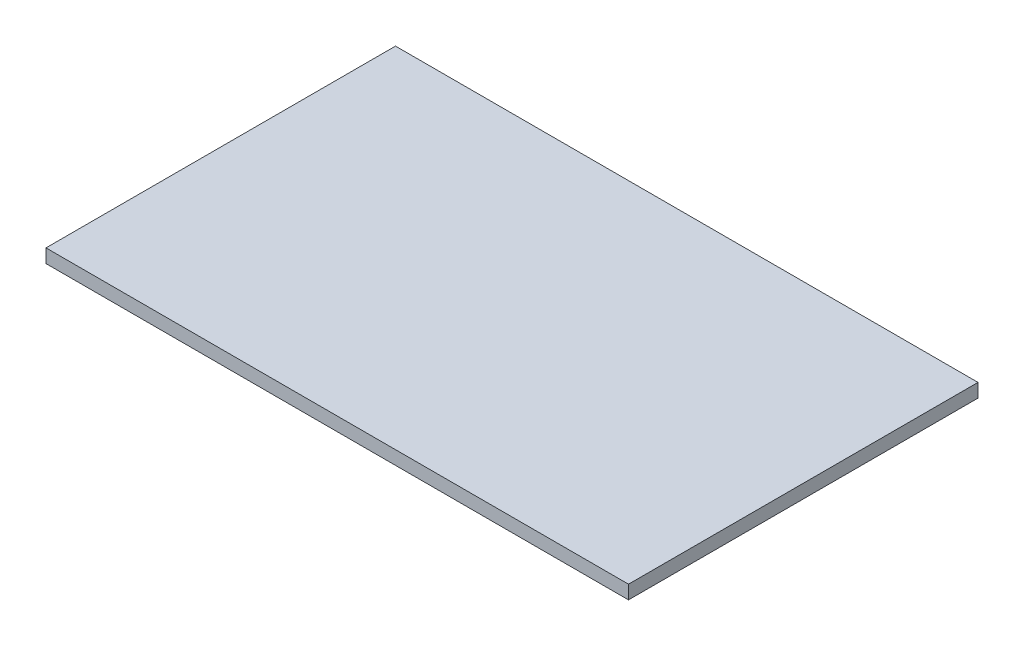
ISO-10303-21;
HEADER;
FILE_DESCRIPTION(('STEP AP214'),'2;1');
FILE_NAME('part.step','',(''),(''),'','','');
FILE_SCHEMA(('AUTOMOTIVE_DESIGN { 1 0 10303 214 1 1 1 1 }'));
ENDSEC;
DATA;
#1=APPLICATION_CONTEXT('core data for automotive mechanical design processes');
#2=APPLICATION_PROTOCOL_DEFINITION('international standard','automotive_design',2000,#1);
#3=PRODUCT_CONTEXT('',#1,'mechanical');
#4=PRODUCT('Part','Part','',(#3));
#5=PRODUCT_RELATED_PRODUCT_CATEGORY('part','',(#4));
#6=PRODUCT_DEFINITION_FORMATION('','',#4);
#7=PRODUCT_DEFINITION_CONTEXT('part definition',#1,'design');
#8=PRODUCT_DEFINITION('design','',#6,#7);
#9=PRODUCT_DEFINITION_SHAPE('','',#8);
#10=(LENGTH_UNIT() NAMED_UNIT(*) SI_UNIT(.MILLI.,.METRE.));
#11=(NAMED_UNIT(*) PLANE_ANGLE_UNIT() SI_UNIT($,.RADIAN.));
#12=(NAMED_UNIT(*) SI_UNIT($,.STERADIAN.) SOLID_ANGLE_UNIT());
#13=UNCERTAINTY_MEASURE_WITH_UNIT(LENGTH_MEASURE(1.E-05),#10,'distance_accuracy_value','');
#14=(GEOMETRIC_REPRESENTATION_CONTEXT(3) GLOBAL_UNCERTAINTY_ASSIGNED_CONTEXT((#13)) GLOBAL_UNIT_ASSIGNED_CONTEXT((#10,
#11,#12)) REPRESENTATION_CONTEXT('',''));
#15=CARTESIAN_POINT('',(0.,0.,0.));
#16=DIRECTION('',(0.,0.,1.));
#17=DIRECTION('',(1.,0.,0.));
#18=AXIS2_PLACEMENT_3D('',#15,#16,#17);
#19=CARTESIAN_POINT('',(0.,2.9718,0.));
#20=DIRECTION('',(1.,0.,0.));
#21=DIRECTION('',(0.,0.,-1.));
#22=AXIS2_PLACEMENT_3D('',#19,#20,#21);
#23=PLANE('',#22);
#24=DIRECTION('',(0.,0.,1.));
#25=VECTOR('',#24,1.);
#26=CARTESIAN_POINT('',(0.,0.,0.));
#27=LINE('',#26,#25);
#28=CARTESIAN_POINT('',(0.,0.,-76.2));
#29=VERTEX_POINT('',#28);
#30=CARTESIAN_POINT('',(0.,0.,0.));
#31=VERTEX_POINT('',#30);
#32=EDGE_CURVE('E96',#29,#31,#27,.T.);
#33=ORIENTED_EDGE('',*,*,#32,.T.);
#34=DIRECTION('',(0.,-1.,0.));
#35=VECTOR('',#34,1.);
#36=CARTESIAN_POINT('',(0.,2.9718,0.));
#37=LINE('',#36,#35);
#38=CARTESIAN_POINT('',(0.,2.9718,0.));
#39=VERTEX_POINT('',#38);
#40=EDGE_CURVE('E11',#39,#31,#37,.T.);
#41=ORIENTED_EDGE('',*,*,#40,.F.);
#42=DIRECTION('',(0.,0.,1.));
#43=VECTOR('',#42,1.);
#44=CARTESIAN_POINT('',(0.,2.9718,0.));
#45=LINE('',#44,#43);
#46=CARTESIAN_POINT('',(0.,2.9718,-76.2));
#47=VERTEX_POINT('',#46);
#48=EDGE_CURVE('E84',#47,#39,#45,.T.);
#49=ORIENTED_EDGE('',*,*,#48,.F.);
#50=DIRECTION('',(0.,-1.,0.));
#51=VECTOR('',#50,1.);
#52=CARTESIAN_POINT('',(0.,2.9718,-76.2));
#53=LINE('',#52,#51);
#54=EDGE_CURVE('E92',#47,#29,#53,.T.);
#55=ORIENTED_EDGE('',*,*,#54,.T.);
#56=EDGE_LOOP('',(#33,#41,#49,#55));
#57=FACE_BOUND('',#56,.T.);
#58=ADVANCED_FACE('F33',(#57),#23,.F.);
#59=CARTESIAN_POINT('',(0.,2.9718,0.));
#60=DIRECTION('',(0.,0.,-1.));
#61=DIRECTION('',(-1.,0.,0.));
#62=AXIS2_PLACEMENT_3D('',#59,#60,#61);
#63=PLANE('',#62);
#64=DIRECTION('',(1.,0.,0.));
#65=VECTOR('',#64,1.);
#66=CARTESIAN_POINT('',(0.,0.,0.));
#67=LINE('',#66,#65);
#68=CARTESIAN_POINT('',(127.,0.,0.));
#69=VERTEX_POINT('',#68);
#70=EDGE_CURVE('E88',#31,#69,#67,.T.);
#71=ORIENTED_EDGE('',*,*,#70,.T.);
#72=DIRECTION('',(0.,-1.,0.));
#73=VECTOR('',#72,1.);
#74=CARTESIAN_POINT('',(127.,2.9718,0.));
#75=LINE('',#74,#73);
#76=CARTESIAN_POINT('',(127.,2.9718,0.));
#77=VERTEX_POINT('',#76);
#78=EDGE_CURVE('E41',#77,#69,#75,.T.);
#79=ORIENTED_EDGE('',*,*,#78,.F.);
#80=DIRECTION('',(1.,0.,0.));
#81=VECTOR('',#80,1.);
#82=CARTESIAN_POINT('',(0.,2.9718,0.));
#83=LINE('',#82,#81);
#84=EDGE_CURVE('E79',#39,#77,#83,.T.);
#85=ORIENTED_EDGE('',*,*,#84,.F.);
#86=ORIENTED_EDGE('',*,*,#40,.T.);
#87=EDGE_LOOP('',(#71,#79,#85,#86));
#88=FACE_BOUND('',#87,.T.);
#89=ADVANCED_FACE('F87',(#88),#63,.F.);
#90=CARTESIAN_POINT('',(127.,2.9718,0.));
#91=DIRECTION('',(-1.,0.,0.));
#92=DIRECTION('',(0.,0.,1.));
#93=AXIS2_PLACEMENT_3D('',#90,#91,#92);
#94=PLANE('',#93);
#95=DIRECTION('',(0.,0.,-1.));
#96=VECTOR('',#95,1.);
#97=CARTESIAN_POINT('',(127.,0.,0.));
#98=LINE('',#97,#96);
#99=CARTESIAN_POINT('',(127.,0.,-76.2));
#100=VERTEX_POINT('',#99);
#101=EDGE_CURVE('E66',#69,#100,#98,.T.);
#102=ORIENTED_EDGE('',*,*,#101,.T.);
#103=DIRECTION('',(0.,-1.,0.));
#104=VECTOR('',#103,1.);
#105=CARTESIAN_POINT('',(127.,2.9718,-76.2));
#106=LINE('',#105,#104);
#107=CARTESIAN_POINT('',(127.,2.9718,-76.2));
#108=VERTEX_POINT('',#107);
#109=EDGE_CURVE('E89',#108,#100,#106,.T.);
#110=ORIENTED_EDGE('',*,*,#109,.F.);
#111=DIRECTION('',(0.,0.,-1.));
#112=VECTOR('',#111,1.);
#113=CARTESIAN_POINT('',(127.,2.9718,0.));
#114=LINE('',#113,#112);
#115=EDGE_CURVE('E82',#77,#108,#114,.T.);
#116=ORIENTED_EDGE('',*,*,#115,.F.);
#117=ORIENTED_EDGE('',*,*,#78,.T.);
#118=EDGE_LOOP('',(#102,#110,#116,#117));
#119=FACE_BOUND('',#118,.T.);
#120=ADVANCED_FACE('F90',(#119),#94,.F.);
#121=CARTESIAN_POINT('',(0.,2.9718,-76.2));
#122=DIRECTION('',(0.,0.,1.));
#123=DIRECTION('',(1.,0.,0.));
#124=AXIS2_PLACEMENT_3D('',#121,#122,#123);
#125=PLANE('',#124);
#126=DIRECTION('',(-1.,0.,0.));
#127=VECTOR('',#126,1.);
#128=CARTESIAN_POINT('',(0.,0.,-76.2));
#129=LINE('',#128,#127);
#130=EDGE_CURVE('E72',#100,#29,#129,.T.);
#131=ORIENTED_EDGE('',*,*,#130,.T.);
#132=ORIENTED_EDGE('',*,*,#54,.F.);
#133=DIRECTION('',(-1.,0.,0.));
#134=VECTOR('',#133,1.);
#135=CARTESIAN_POINT('',(0.,2.9718,-76.2));
#136=LINE('',#135,#134);
#137=EDGE_CURVE('E49',#108,#47,#136,.T.);
#138=ORIENTED_EDGE('',*,*,#137,.F.);
#139=ORIENTED_EDGE('',*,*,#109,.T.);
#140=EDGE_LOOP('',(#131,#132,#138,#139));
#141=FACE_BOUND('',#140,.T.);
#142=ADVANCED_FACE('F103',(#141),#125,.F.);
#143=CARTESIAN_POINT('',(0.,2.9718,0.));
#144=DIRECTION('',(0.,-1.,0.));
#145=DIRECTION('',(0.,0.,-1.));
#146=AXIS2_PLACEMENT_3D('',#143,#144,#145);
#147=PLANE('',#146);
#148=ORIENTED_EDGE('',*,*,#48,.T.);
#149=ORIENTED_EDGE('',*,*,#84,.T.);
#150=ORIENTED_EDGE('',*,*,#115,.T.);
#151=ORIENTED_EDGE('',*,*,#137,.T.);
#152=EDGE_LOOP('',(#148,#149,#150,#151));
#153=FACE_BOUND('',#152,.T.);
#154=ADVANCED_FACE('F80',(#153),#147,.F.);
#155=CARTESIAN_POINT('',(0.,0.,0.));
#156=DIRECTION('',(0.,-1.,0.));
#157=DIRECTION('',(0.,0.,-1.));
#158=AXIS2_PLACEMENT_3D('',#155,#156,#157);
#159=PLANE('',#158);
#160=ORIENTED_EDGE('',*,*,#32,.F.);
#161=ORIENTED_EDGE('',*,*,#130,.F.);
#162=ORIENTED_EDGE('',*,*,#101,.F.);
#163=ORIENTED_EDGE('',*,*,#70,.F.);
#164=EDGE_LOOP('',(#160,#161,#162,#163));
#165=FACE_BOUND('',#164,.T.);
#166=ADVANCED_FACE('F106',(#165),#159,.T.);
#167=CLOSED_SHELL('',(#58,#89,#120,#142,#154,#166));
#168=MANIFOLD_SOLID_BREP('B2',#167);
#169=ADVANCED_BREP_SHAPE_REPRESENTATION('',(#18,#168),#14);
#170=SHAPE_DEFINITION_REPRESENTATION(#9,#169);
ENDSEC;
END-ISO-10303-21;
